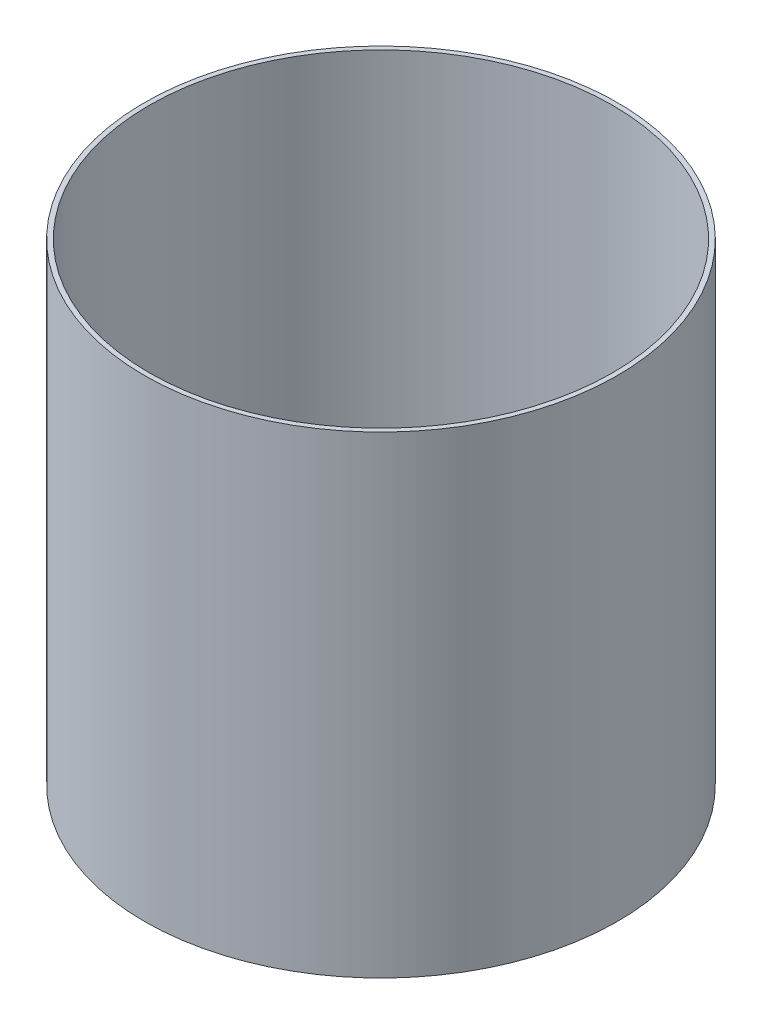
ISO-10303-21;
HEADER;
FILE_DESCRIPTION(('STEP AP214'),'2;1');
FILE_NAME('part.step','',(''),(''),'','','');
FILE_SCHEMA(('AUTOMOTIVE_DESIGN { 1 0 10303 214 1 1 1 1 }'));
ENDSEC;
DATA;
#1=APPLICATION_CONTEXT('core data for automotive mechanical design processes');
#2=APPLICATION_PROTOCOL_DEFINITION('international standard','automotive_design',2000,#1);
#3=PRODUCT_CONTEXT('',#1,'mechanical');
#4=PRODUCT('Part','Part','',(#3));
#5=PRODUCT_RELATED_PRODUCT_CATEGORY('part','',(#4));
#6=PRODUCT_DEFINITION_FORMATION('','',#4);
#7=PRODUCT_DEFINITION_CONTEXT('part definition',#1,'design');
#8=PRODUCT_DEFINITION('design','',#6,#7);
#9=PRODUCT_DEFINITION_SHAPE('','',#8);
#10=(LENGTH_UNIT() NAMED_UNIT(*) SI_UNIT(.MILLI.,.METRE.));
#11=(NAMED_UNIT(*) PLANE_ANGLE_UNIT() SI_UNIT($,.RADIAN.));
#12=(NAMED_UNIT(*) SI_UNIT($,.STERADIAN.) SOLID_ANGLE_UNIT());
#13=UNCERTAINTY_MEASURE_WITH_UNIT(LENGTH_MEASURE(1.E-05),#10,'distance_accuracy_value','');
#14=(GEOMETRIC_REPRESENTATION_CONTEXT(3) GLOBAL_UNCERTAINTY_ASSIGNED_CONTEXT((#13)) GLOBAL_UNIT_ASSIGNED_CONTEXT((#10,
#11,#12)) REPRESENTATION_CONTEXT('',''));
#15=CARTESIAN_POINT('',(0.,0.,0.));
#16=DIRECTION('',(0.,0.,1.));
#17=DIRECTION('',(1.,0.,0.));
#18=AXIS2_PLACEMENT_3D('',#15,#16,#17);
#19=CARTESIAN_POINT('',(0.,100.,0.));
#20=DIRECTION('',(0.,1.,0.));
#21=DIRECTION('',(0.,0.,1.));
#22=AXIS2_PLACEMENT_3D('',#19,#20,#21);
#23=PLANE('',#22);
#24=CARTESIAN_POINT('',(0.,100.,0.));
#25=DIRECTION('',(0.,1.,0.));
#26=DIRECTION('',(0.,0.,1.));
#27=AXIS2_PLACEMENT_3D('',#24,#25,#26);
#28=CIRCLE('',#27,50.);
#29=CARTESIAN_POINT('',(0.,100.,50.));
#30=VERTEX_POINT('',#29);
#31=EDGE_CURVE('E11',#30,#30,#28,.T.);
#32=ORIENTED_EDGE('',*,*,#31,.T.);
#33=EDGE_LOOP('',(#32));
#34=FACE_BOUND('',#33,.T.);
#35=CARTESIAN_POINT('',(0.,100.,0.));
#36=DIRECTION('',(0.,1.,0.));
#37=DIRECTION('',(1.,0.,0.));
#38=AXIS2_PLACEMENT_3D('',#35,#36,#37);
#39=CIRCLE('',#38,49.);
#40=CARTESIAN_POINT('',(49.,100.,0.));
#41=VERTEX_POINT('',#40);
#42=EDGE_CURVE('E56',#41,#41,#39,.T.);
#43=ORIENTED_EDGE('',*,*,#42,.F.);
#44=EDGE_LOOP('',(#43));
#45=FACE_BOUND('',#44,.T.);
#46=ADVANCED_FACE('F43',(#34,#45),#23,.T.);
#47=CARTESIAN_POINT('',(0.,0.,0.));
#48=DIRECTION('',(0.,1.,0.));
#49=DIRECTION('',(0.,0.,1.));
#50=AXIS2_PLACEMENT_3D('',#47,#48,#49);
#51=PLANE('',#50);
#52=CARTESIAN_POINT('',(0.,0.,0.));
#53=DIRECTION('',(0.,1.,0.));
#54=DIRECTION('',(0.,0.,1.));
#55=AXIS2_PLACEMENT_3D('',#52,#53,#54);
#56=CIRCLE('',#55,50.);
#57=CARTESIAN_POINT('',(0.,0.,50.));
#58=VERTEX_POINT('',#57);
#59=EDGE_CURVE('E47',#58,#58,#56,.T.);
#60=ORIENTED_EDGE('',*,*,#59,.F.);
#61=EDGE_LOOP('',(#60));
#62=FACE_BOUND('',#61,.T.);
#63=CARTESIAN_POINT('',(0.,0.,0.));
#64=DIRECTION('',(0.,1.,0.));
#65=DIRECTION('',(1.,0.,0.));
#66=AXIS2_PLACEMENT_3D('',#63,#64,#65);
#67=CIRCLE('',#66,49.);
#68=CARTESIAN_POINT('',(49.,0.,0.));
#69=VERTEX_POINT('',#68);
#70=EDGE_CURVE('E58',#69,#69,#67,.T.);
#71=ORIENTED_EDGE('',*,*,#70,.T.);
#72=EDGE_LOOP('',(#71));
#73=FACE_BOUND('',#72,.T.);
#74=ADVANCED_FACE('F70',(#62,#73),#51,.F.);
#75=CARTESIAN_POINT('',(0.,100.,0.));
#76=DIRECTION('',(0.,-1.,0.));
#77=DIRECTION('',(0.,0.,-1.));
#78=AXIS2_PLACEMENT_3D('',#75,#76,#77);
#79=CYLINDRICAL_SURFACE('',#78,50.);
#80=ORIENTED_EDGE('',*,*,#31,.F.);
#81=EDGE_LOOP('',(#80));
#82=FACE_BOUND('',#81,.T.);
#83=ORIENTED_EDGE('',*,*,#59,.T.);
#84=EDGE_LOOP('',(#83));
#85=FACE_BOUND('',#84,.T.);
#86=ADVANCED_FACE('F45',(#82,#85),#79,.T.);
#87=CARTESIAN_POINT('',(0.,100.,0.));
#88=DIRECTION('',(0.,-1.,0.));
#89=DIRECTION('',(0.,0.,-1.));
#90=AXIS2_PLACEMENT_3D('',#87,#88,#89);
#91=CYLINDRICAL_SURFACE('',#90,49.);
#92=ORIENTED_EDGE('',*,*,#42,.T.);
#93=EDGE_LOOP('',(#92));
#94=FACE_BOUND('',#93,.T.);
#95=ORIENTED_EDGE('',*,*,#70,.F.);
#96=EDGE_LOOP('',(#95));
#97=FACE_BOUND('',#96,.T.);
#98=ADVANCED_FACE('F66',(#94,#97),#91,.F.);
#99=CLOSED_SHELL('',(#46,#74,#86,#98));
#100=MANIFOLD_SOLID_BREP('B2',#99);
#101=ADVANCED_BREP_SHAPE_REPRESENTATION('',(#18,#100),#14);
#102=SHAPE_DEFINITION_REPRESENTATION(#9,#101);
ENDSEC;
END-ISO-10303-21;
